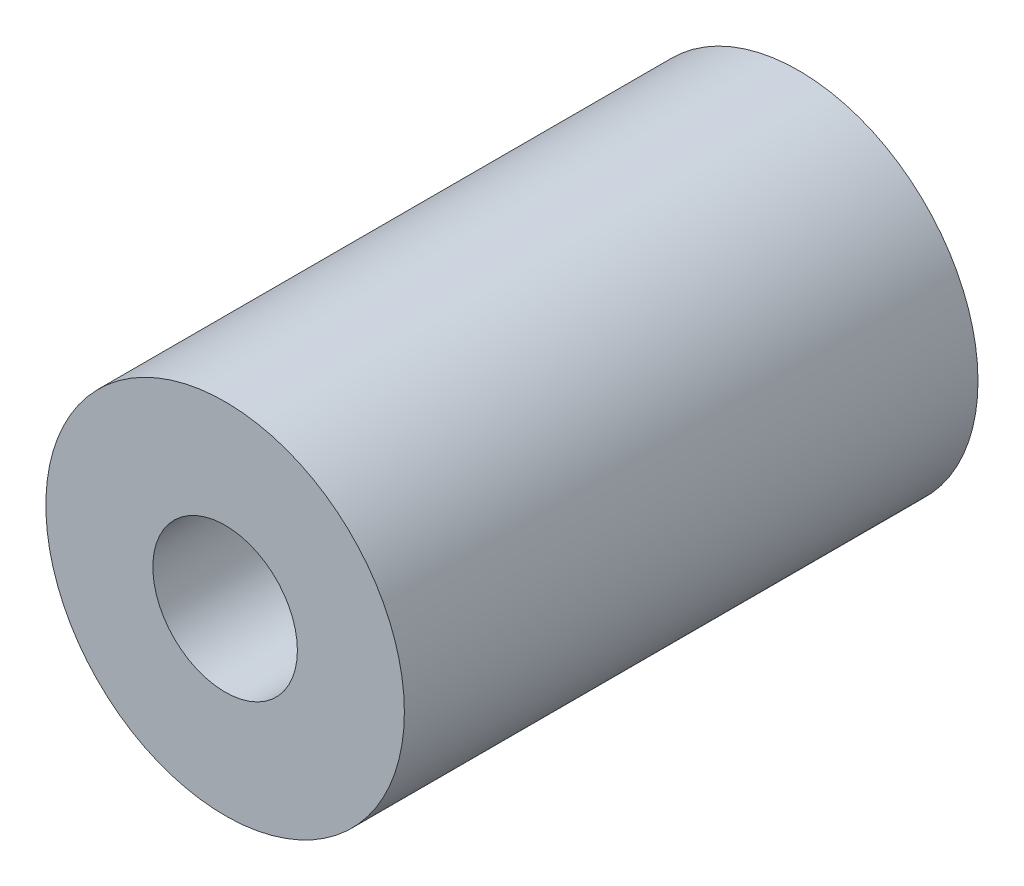
ISO-10303-21;
HEADER;
FILE_DESCRIPTION(('STEP AP214'),'2;1');
FILE_NAME('part.step','',(''),(''),'','','');
FILE_SCHEMA(('AUTOMOTIVE_DESIGN { 1 0 10303 214 1 1 1 1 }'));
ENDSEC;
DATA;
#1=APPLICATION_CONTEXT('core data for automotive mechanical design processes');
#2=APPLICATION_PROTOCOL_DEFINITION('international standard','automotive_design',2000,#1);
#3=PRODUCT_CONTEXT('',#1,'mechanical');
#4=PRODUCT('Part','Part','',(#3));
#5=PRODUCT_RELATED_PRODUCT_CATEGORY('part','',(#4));
#6=PRODUCT_DEFINITION_FORMATION('','',#4);
#7=PRODUCT_DEFINITION_CONTEXT('part definition',#1,'design');
#8=PRODUCT_DEFINITION('design','',#6,#7);
#9=PRODUCT_DEFINITION_SHAPE('','',#8);
#10=(LENGTH_UNIT() NAMED_UNIT(*) SI_UNIT(.MILLI.,.METRE.));
#11=(NAMED_UNIT(*) PLANE_ANGLE_UNIT() SI_UNIT($,.RADIAN.));
#12=(NAMED_UNIT(*) SI_UNIT($,.STERADIAN.) SOLID_ANGLE_UNIT());
#13=UNCERTAINTY_MEASURE_WITH_UNIT(LENGTH_MEASURE(1.E-05),#10,'distance_accuracy_value','');
#14=(GEOMETRIC_REPRESENTATION_CONTEXT(3) GLOBAL_UNCERTAINTY_ASSIGNED_CONTEXT((#13)) GLOBAL_UNIT_ASSIGNED_CONTEXT((#10,
#11,#12)) REPRESENTATION_CONTEXT('',''));
#15=CARTESIAN_POINT('',(0.,0.,0.));
#16=DIRECTION('',(0.,0.,1.));
#17=DIRECTION('',(1.,0.,0.));
#18=AXIS2_PLACEMENT_3D('',#15,#16,#17);
#19=CARTESIAN_POINT('',(0.,0.,12.7));
#20=DIRECTION('',(0.,0.,1.));
#21=DIRECTION('',(1.,0.,0.));
#22=AXIS2_PLACEMENT_3D('',#19,#20,#21);
#23=PLANE('',#22);
#24=CARTESIAN_POINT('',(0.,0.,12.7));
#25=DIRECTION('',(0.,0.,1.));
#26=DIRECTION('',(1.,0.,0.));
#27=AXIS2_PLACEMENT_3D('',#24,#25,#26);
#28=CIRCLE('',#27,7.9375);
#29=CARTESIAN_POINT('',(7.9375,0.,12.7));
#30=VERTEX_POINT('',#29);
#31=EDGE_CURVE('E11',#30,#30,#28,.T.);
#32=ORIENTED_EDGE('',*,*,#31,.T.);
#33=EDGE_LOOP('',(#32));
#34=FACE_BOUND('',#33,.T.);
#35=CARTESIAN_POINT('',(0.,0.,12.7));
#36=DIRECTION('',(0.,0.,1.));
#37=DIRECTION('',(1.,0.,0.));
#38=AXIS2_PLACEMENT_3D('',#35,#36,#37);
#39=CIRCLE('',#38,3.2004);
#40=CARTESIAN_POINT('',(3.2004,0.,12.7));
#41=VERTEX_POINT('',#40);
#42=EDGE_CURVE('E56',#41,#41,#39,.T.);
#43=ORIENTED_EDGE('',*,*,#42,.F.);
#44=EDGE_LOOP('',(#43));
#45=FACE_BOUND('',#44,.T.);
#46=ADVANCED_FACE('F40',(#34,#45),#23,.T.);
#47=CARTESIAN_POINT('',(0.,0.,-12.7));
#48=DIRECTION('',(0.,0.,1.));
#49=DIRECTION('',(1.,0.,0.));
#50=AXIS2_PLACEMENT_3D('',#47,#48,#49);
#51=PLANE('',#50);
#52=CARTESIAN_POINT('',(0.,0.,-12.7));
#53=DIRECTION('',(0.,0.,1.));
#54=DIRECTION('',(1.,0.,0.));
#55=AXIS2_PLACEMENT_3D('',#52,#53,#54);
#56=CIRCLE('',#55,7.9375);
#57=CARTESIAN_POINT('',(7.9375,0.,-12.7));
#58=VERTEX_POINT('',#57);
#59=EDGE_CURVE('E45',#58,#58,#56,.T.);
#60=ORIENTED_EDGE('',*,*,#59,.F.);
#61=EDGE_LOOP('',(#60));
#62=FACE_BOUND('',#61,.T.);
#63=CARTESIAN_POINT('',(0.,0.,-12.7));
#64=DIRECTION('',(0.,0.,1.));
#65=DIRECTION('',(1.,0.,0.));
#66=AXIS2_PLACEMENT_3D('',#63,#64,#65);
#67=CIRCLE('',#66,3.2004);
#68=CARTESIAN_POINT('',(3.2004,0.,-12.7));
#69=VERTEX_POINT('',#68);
#70=EDGE_CURVE('E58',#69,#69,#67,.T.);
#71=ORIENTED_EDGE('',*,*,#70,.T.);
#72=EDGE_LOOP('',(#71));
#73=FACE_BOUND('',#72,.T.);
#74=ADVANCED_FACE('F71',(#62,#73),#51,.F.);
#75=CARTESIAN_POINT('',(0.,0.,12.7));
#76=DIRECTION('',(0.,0.,-1.));
#77=DIRECTION('',(-1.,0.,0.));
#78=AXIS2_PLACEMENT_3D('',#75,#76,#77);
#79=CYLINDRICAL_SURFACE('',#78,7.9375);
#80=ORIENTED_EDGE('',*,*,#31,.F.);
#81=EDGE_LOOP('',(#80));
#82=FACE_BOUND('',#81,.T.);
#83=ORIENTED_EDGE('',*,*,#59,.T.);
#84=EDGE_LOOP('',(#83));
#85=FACE_BOUND('',#84,.T.);
#86=ADVANCED_FACE('F43',(#82,#85),#79,.T.);
#87=CARTESIAN_POINT('',(0.,0.,12.7));
#88=DIRECTION('',(0.,0.,-1.));
#89=DIRECTION('',(-1.,0.,0.));
#90=AXIS2_PLACEMENT_3D('',#87,#88,#89);
#91=CYLINDRICAL_SURFACE('',#90,3.2004);
#92=ORIENTED_EDGE('',*,*,#42,.T.);
#93=EDGE_LOOP('',(#92));
#94=FACE_BOUND('',#93,.T.);
#95=ORIENTED_EDGE('',*,*,#70,.F.);
#96=EDGE_LOOP('',(#95));
#97=FACE_BOUND('',#96,.T.);
#98=ADVANCED_FACE('F73',(#94,#97),#91,.F.);
#99=CLOSED_SHELL('',(#46,#74,#86,#98));
#100=MANIFOLD_SOLID_BREP('B2',#99);
#101=ADVANCED_BREP_SHAPE_REPRESENTATION('',(#18,#100),#14);
#102=SHAPE_DEFINITION_REPRESENTATION(#9,#101);
ENDSEC;
END-ISO-10303-21;
